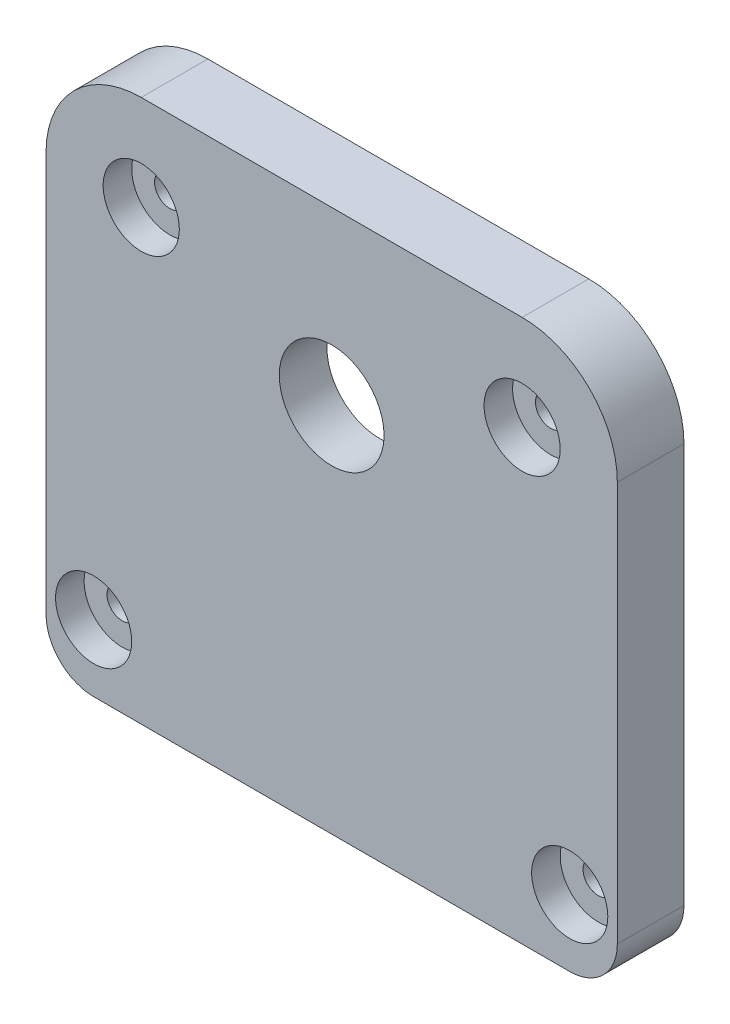
ISO-10303-21;
HEADER;
FILE_DESCRIPTION(('STEP AP214'),'2;1');
FILE_NAME('part.step','',(''),(''),'','','');
FILE_SCHEMA(('AUTOMOTIVE_DESIGN { 1 0 10303 214 1 1 1 1 }'));
ENDSEC;
DATA;
#1=APPLICATION_CONTEXT('core data for automotive mechanical design processes');
#2=APPLICATION_PROTOCOL_DEFINITION('international standard','automotive_design',2000,#1);
#3=PRODUCT_CONTEXT('',#1,'mechanical');
#4=PRODUCT('Part','Part','',(#3));
#5=PRODUCT_RELATED_PRODUCT_CATEGORY('part','',(#4));
#6=PRODUCT_DEFINITION_FORMATION('','',#4);
#7=PRODUCT_DEFINITION_CONTEXT('part definition',#1,'design');
#8=PRODUCT_DEFINITION('design','',#6,#7);
#9=PRODUCT_DEFINITION_SHAPE('','',#8);
#10=(LENGTH_UNIT() NAMED_UNIT(*) SI_UNIT(.MILLI.,.METRE.));
#11=(NAMED_UNIT(*) PLANE_ANGLE_UNIT() SI_UNIT($,.RADIAN.));
#12=(NAMED_UNIT(*) SI_UNIT($,.STERADIAN.) SOLID_ANGLE_UNIT());
#13=UNCERTAINTY_MEASURE_WITH_UNIT(LENGTH_MEASURE(1.E-05),#10,'distance_accuracy_value','');
#14=(GEOMETRIC_REPRESENTATION_CONTEXT(3) GLOBAL_UNCERTAINTY_ASSIGNED_CONTEXT((#13)) GLOBAL_UNIT_ASSIGNED_CONTEXT((#10,
#11,#12)) REPRESENTATION_CONTEXT('',''));
#15=CARTESIAN_POINT('',(0.,0.,0.));
#16=DIRECTION('',(0.,0.,1.));
#17=DIRECTION('',(1.,0.,0.));
#18=AXIS2_PLACEMENT_3D('',#15,#16,#17);
#19=CARTESIAN_POINT('',(20.0000000000015,22.0000000000005,10.));
#20=DIRECTION('',(0.,0.,-1.));
#21=DIRECTION('',(-1.,0.,0.));
#22=AXIS2_PLACEMENT_3D('',#19,#20,#21);
#23=CYLINDRICAL_SURFACE('',#22,1.60000000000141);
#24=CARTESIAN_POINT('',(20.0000000000015,22.0000000000005,3.));
#25=DIRECTION('',(0.,0.,-1.));
#26=DIRECTION('',(-1.,0.,0.));
#27=AXIS2_PLACEMENT_3D('',#24,#25,#26);
#28=CIRCLE('',#27,1.60000000000141);
#29=CARTESIAN_POINT('',(18.4000000000001,22.0000000000005,3.));
#30=VERTEX_POINT('',#29);
#31=EDGE_CURVE('E222',#30,#30,#28,.F.);
#32=ORIENTED_EDGE('',*,*,#31,.F.);
#33=EDGE_LOOP('',(#32));
#34=FACE_BOUND('',#33,.T.);
#35=CARTESIAN_POINT('',(20.0000000000015,22.0000000000005,7.));
#36=DIRECTION('',(0.,0.,1.));
#37=DIRECTION('',(1.,0.,0.));
#38=AXIS2_PLACEMENT_3D('',#35,#36,#37);
#39=CIRCLE('',#38,1.60000000000141);
#40=CARTESIAN_POINT('',(21.6000000000029,22.0000000000005,7.));
#41=VERTEX_POINT('',#40);
#42=EDGE_CURVE('E49',#41,#41,#39,.F.);
#43=ORIENTED_EDGE('',*,*,#42,.F.);
#44=EDGE_LOOP('',(#43));
#45=FACE_BOUND('',#44,.T.);
#46=ADVANCED_FACE('F45',(#34,#45),#23,.F.);
#47=CARTESIAN_POINT('',(25.0000000000016,-17.9999999999997,10.));
#48=DIRECTION('',(0.,0.,-1.));
#49=DIRECTION('',(-1.,0.,0.));
#50=AXIS2_PLACEMENT_3D('',#47,#48,#49);
#51=CYLINDRICAL_SURFACE('',#50,1.6000000000014);
#52=CARTESIAN_POINT('',(25.0000000000016,-17.9999999999997,3.));
#53=DIRECTION('',(0.,0.,-1.));
#54=DIRECTION('',(-1.,0.,0.));
#55=AXIS2_PLACEMENT_3D('',#52,#53,#54);
#56=CIRCLE('',#55,1.6000000000014);
#57=CARTESIAN_POINT('',(23.4000000000002,-17.9999999999997,3.));
#58=VERTEX_POINT('',#57);
#59=EDGE_CURVE('E225',#58,#58,#56,.F.);
#60=ORIENTED_EDGE('',*,*,#59,.F.);
#61=EDGE_LOOP('',(#60));
#62=FACE_BOUND('',#61,.T.);
#63=CARTESIAN_POINT('',(25.0000000000016,-17.9999999999997,7.));
#64=DIRECTION('',(0.,0.,1.));
#65=DIRECTION('',(1.,0.,0.));
#66=AXIS2_PLACEMENT_3D('',#63,#64,#65);
#67=CIRCLE('',#66,1.6000000000014);
#68=CARTESIAN_POINT('',(26.600000000003,-17.9999999999997,7.));
#69=VERTEX_POINT('',#68);
#70=EDGE_CURVE('E136',#69,#69,#67,.F.);
#71=ORIENTED_EDGE('',*,*,#70,.F.);
#72=EDGE_LOOP('',(#71));
#73=FACE_BOUND('',#72,.T.);
#74=ADVANCED_FACE('F146',(#62,#73),#51,.F.);
#75=CARTESIAN_POINT('',(-19.9999999999986,22.0000000000002,10.));
#76=DIRECTION('',(0.,0.,-1.));
#77=DIRECTION('',(-1.,0.,0.));
#78=AXIS2_PLACEMENT_3D('',#75,#76,#77);
#79=CYLINDRICAL_SURFACE('',#78,1.6000000000014);
#80=CARTESIAN_POINT('',(-19.9999999999986,22.0000000000002,3.));
#81=DIRECTION('',(0.,0.,-1.));
#82=DIRECTION('',(-1.,0.,0.));
#83=AXIS2_PLACEMENT_3D('',#80,#81,#82);
#84=CIRCLE('',#83,1.6000000000014);
#85=CARTESIAN_POINT('',(-21.6,22.0000000000002,3.));
#86=VERTEX_POINT('',#85);
#87=EDGE_CURVE('E228',#86,#86,#84,.F.);
#88=ORIENTED_EDGE('',*,*,#87,.F.);
#89=EDGE_LOOP('',(#88));
#90=FACE_BOUND('',#89,.T.);
#91=CARTESIAN_POINT('',(-19.9999999999986,22.0000000000002,7.));
#92=DIRECTION('',(0.,0.,1.));
#93=DIRECTION('',(1.,0.,0.));
#94=AXIS2_PLACEMENT_3D('',#91,#92,#93);
#95=CIRCLE('',#94,1.6000000000014);
#96=CARTESIAN_POINT('',(-18.3999999999972,22.0000000000002,7.));
#97=VERTEX_POINT('',#96);
#98=EDGE_CURVE('E133',#97,#97,#95,.F.);
#99=ORIENTED_EDGE('',*,*,#98,.F.);
#100=EDGE_LOOP('',(#99));
#101=FACE_BOUND('',#100,.T.);
#102=ADVANCED_FACE('F153',(#90,#101),#79,.F.);
#103=CARTESIAN_POINT('',(-24.9999999999984,-18.,10.));
#104=DIRECTION('',(0.,0.,-1.));
#105=DIRECTION('',(-1.,0.,0.));
#106=AXIS2_PLACEMENT_3D('',#103,#104,#105);
#107=CYLINDRICAL_SURFACE('',#106,1.60000000000141);
#108=CARTESIAN_POINT('',(-24.9999999999984,-18.,3.));
#109=DIRECTION('',(0.,0.,-1.));
#110=DIRECTION('',(-1.,0.,0.));
#111=AXIS2_PLACEMENT_3D('',#108,#109,#110);
#112=CIRCLE('',#111,1.60000000000141);
#113=CARTESIAN_POINT('',(-26.5999999999998,-18.,3.));
#114=VERTEX_POINT('',#113);
#115=EDGE_CURVE('E231',#114,#114,#112,.F.);
#116=ORIENTED_EDGE('',*,*,#115,.F.);
#117=EDGE_LOOP('',(#116));
#118=FACE_BOUND('',#117,.T.);
#119=CARTESIAN_POINT('',(-24.9999999999984,-18.,7.));
#120=DIRECTION('',(0.,0.,1.));
#121=DIRECTION('',(1.,0.,0.));
#122=AXIS2_PLACEMENT_3D('',#119,#120,#121);
#123=CIRCLE('',#122,1.60000000000141);
#124=CARTESIAN_POINT('',(-23.399999999997,-18.,7.));
#125=VERTEX_POINT('',#124);
#126=EDGE_CURVE('E130',#125,#125,#123,.F.);
#127=ORIENTED_EDGE('',*,*,#126,.F.);
#128=EDGE_LOOP('',(#127));
#129=FACE_BOUND('',#128,.T.);
#130=ADVANCED_FACE('F159',(#118,#129),#107,.F.);
#131=CARTESIAN_POINT('',(30.,-25.,5.));
#132=DIRECTION('',(-1.,0.,0.));
#133=DIRECTION('',(0.,0.,1.));
#134=AXIS2_PLACEMENT_3D('',#131,#132,#133);
#135=PLANE('',#134);
#136=DIRECTION('',(0.,-1.,0.));
#137=VECTOR('',#136,1.);
#138=CARTESIAN_POINT('',(30.,-25.,3.));
#139=LINE('',#138,#137);
#140=CARTESIAN_POINT('',(30.,22.,3.));
#141=VERTEX_POINT('',#140);
#142=CARTESIAN_POINT('',(30.,-20.,3.));
#143=VERTEX_POINT('',#142);
#144=EDGE_CURVE('E62',#141,#143,#139,.T.);
#145=ORIENTED_EDGE('',*,*,#144,.F.);
#146=DIRECTION('',(0.,0.,-1.));
#147=VECTOR('',#146,1.);
#148=CARTESIAN_POINT('',(30.,22.,5.));
#149=LINE('',#148,#147);
#150=CARTESIAN_POINT('',(30.,22.,10.));
#151=VERTEX_POINT('',#150);
#152=EDGE_CURVE('E200',#141,#151,#149,.F.);
#153=ORIENTED_EDGE('',*,*,#152,.T.);
#154=DIRECTION('',(0.,1.,0.));
#155=VECTOR('',#154,1.);
#156=CARTESIAN_POINT('',(30.,-25.,10.));
#157=LINE('',#156,#155);
#158=CARTESIAN_POINT('',(30.,-20.,10.));
#159=VERTEX_POINT('',#158);
#160=EDGE_CURVE('E216',#159,#151,#157,.T.);
#161=ORIENTED_EDGE('',*,*,#160,.F.);
#162=DIRECTION('',(0.,0.,-1.));
#163=VECTOR('',#162,1.);
#164=CARTESIAN_POINT('',(30.,-20.,5.));
#165=LINE('',#164,#163);
#166=EDGE_CURVE('E123',#159,#143,#165,.T.);
#167=ORIENTED_EDGE('',*,*,#166,.T.);
#168=EDGE_LOOP('',(#145,#153,#161,#167));
#169=FACE_BOUND('',#168,.T.);
#170=ADVANCED_FACE('F171',(#169),#135,.F.);
#171=CARTESIAN_POINT('',(-30.,-25.,5.));
#172=DIRECTION('',(1.,0.,0.));
#173=DIRECTION('',(0.,0.,-1.));
#174=AXIS2_PLACEMENT_3D('',#171,#172,#173);
#175=PLANE('',#174);
#176=DIRECTION('',(0.,1.,0.));
#177=VECTOR('',#176,1.);
#178=CARTESIAN_POINT('',(-30.,-25.,3.));
#179=LINE('',#178,#177);
#180=CARTESIAN_POINT('',(-30.,-20.,3.));
#181=VERTEX_POINT('',#180);
#182=CARTESIAN_POINT('',(-30.,22.,3.));
#183=VERTEX_POINT('',#182);
#184=EDGE_CURVE('E237',#181,#183,#179,.T.);
#185=ORIENTED_EDGE('',*,*,#184,.F.);
#186=DIRECTION('',(0.,0.,-1.));
#187=VECTOR('',#186,1.);
#188=CARTESIAN_POINT('',(-30.,-20.,5.));
#189=LINE('',#188,#187);
#190=CARTESIAN_POINT('',(-30.,-20.,10.));
#191=VERTEX_POINT('',#190);
#192=EDGE_CURVE('E190',#181,#191,#189,.F.);
#193=ORIENTED_EDGE('',*,*,#192,.T.);
#194=DIRECTION('',(0.,-1.,0.));
#195=VECTOR('',#194,1.);
#196=CARTESIAN_POINT('',(-30.,-25.,10.));
#197=LINE('',#196,#195);
#198=CARTESIAN_POINT('',(-30.,22.,10.));
#199=VERTEX_POINT('',#198);
#200=EDGE_CURVE('E214',#199,#191,#197,.T.);
#201=ORIENTED_EDGE('',*,*,#200,.F.);
#202=DIRECTION('',(0.,0.,1.));
#203=VECTOR('',#202,1.);
#204=CARTESIAN_POINT('',(-30.,22.,5.));
#205=LINE('',#204,#203);
#206=EDGE_CURVE('E205',#199,#183,#205,.F.);
#207=ORIENTED_EDGE('',*,*,#206,.T.);
#208=EDGE_LOOP('',(#185,#193,#201,#207));
#209=FACE_BOUND('',#208,.T.);
#210=ADVANCED_FACE('F168',(#209),#175,.F.);
#211=CARTESIAN_POINT('',(-30.,-25.,5.));
#212=DIRECTION('',(0.,1.,0.));
#213=DIRECTION('',(0.,0.,1.));
#214=AXIS2_PLACEMENT_3D('',#211,#212,#213);
#215=PLANE('',#214);
#216=DIRECTION('',(-1.,0.,0.));
#217=VECTOR('',#216,1.);
#218=CARTESIAN_POINT('',(-30.,-25.,3.));
#219=LINE('',#218,#217);
#220=CARTESIAN_POINT('',(25.,-25.,3.));
#221=VERTEX_POINT('',#220);
#222=CARTESIAN_POINT('',(-25.,-25.,3.));
#223=VERTEX_POINT('',#222);
#224=EDGE_CURVE('E112',#221,#223,#219,.T.);
#225=ORIENTED_EDGE('',*,*,#224,.F.);
#226=DIRECTION('',(0.,0.,-1.));
#227=VECTOR('',#226,1.);
#228=CARTESIAN_POINT('',(25.,-25.,5.));
#229=LINE('',#228,#227);
#230=CARTESIAN_POINT('',(25.,-25.,10.));
#231=VERTEX_POINT('',#230);
#232=EDGE_CURVE('E69',#221,#231,#229,.F.);
#233=ORIENTED_EDGE('',*,*,#232,.T.);
#234=DIRECTION('',(1.,0.,0.));
#235=VECTOR('',#234,1.);
#236=CARTESIAN_POINT('',(-30.,-25.,10.));
#237=LINE('',#236,#235);
#238=CARTESIAN_POINT('',(-25.,-25.,10.));
#239=VERTEX_POINT('',#238);
#240=EDGE_CURVE('E212',#239,#231,#237,.T.);
#241=ORIENTED_EDGE('',*,*,#240,.F.);
#242=DIRECTION('',(0.,0.,-1.));
#243=VECTOR('',#242,1.);
#244=CARTESIAN_POINT('',(-25.,-25.,5.));
#245=LINE('',#244,#243);
#246=EDGE_CURVE('E120',#239,#223,#245,.T.);
#247=ORIENTED_EDGE('',*,*,#246,.T.);
#248=EDGE_LOOP('',(#225,#233,#241,#247));
#249=FACE_BOUND('',#248,.T.);
#250=ADVANCED_FACE('F118',(#249),#215,.F.);
#251=CARTESIAN_POINT('',(0.,32.,0.));
#252=DIRECTION('',(0.,-1.,0.));
#253=DIRECTION('',(0.,0.,-1.));
#254=AXIS2_PLACEMENT_3D('',#251,#252,#253);
#255=PLANE('',#254);
#256=DIRECTION('',(1.,0.,0.));
#257=VECTOR('',#256,1.);
#258=CARTESIAN_POINT('',(0.,32.,3.));
#259=LINE('',#258,#257);
#260=CARTESIAN_POINT('',(-20.,32.,3.));
#261=VERTEX_POINT('',#260);
#262=CARTESIAN_POINT('',(20.,32.,3.));
#263=VERTEX_POINT('',#262);
#264=EDGE_CURVE('E239',#261,#263,#259,.T.);
#265=ORIENTED_EDGE('',*,*,#264,.F.);
#266=DIRECTION('',(0.,0.,1.));
#267=VECTOR('',#266,1.);
#268=CARTESIAN_POINT('',(-20.,32.,0.));
#269=LINE('',#268,#267);
#270=CARTESIAN_POINT('',(-20.,32.,10.));
#271=VERTEX_POINT('',#270);
#272=EDGE_CURVE('E210',#261,#271,#269,.T.);
#273=ORIENTED_EDGE('',*,*,#272,.T.);
#274=DIRECTION('',(1.,0.,0.));
#275=VECTOR('',#274,1.);
#276=CARTESIAN_POINT('',(-30.,32.,10.));
#277=LINE('',#276,#275);
#278=CARTESIAN_POINT('',(20.,32.,10.));
#279=VERTEX_POINT('',#278);
#280=EDGE_CURVE('E219',#271,#279,#277,.T.);
#281=ORIENTED_EDGE('',*,*,#280,.T.);
#282=DIRECTION('',(0.,0.,-1.));
#283=VECTOR('',#282,1.);
#284=CARTESIAN_POINT('',(20.,32.,0.));
#285=LINE('',#284,#283);
#286=EDGE_CURVE('E202',#279,#263,#285,.T.);
#287=ORIENTED_EDGE('',*,*,#286,.T.);
#288=EDGE_LOOP('',(#265,#273,#281,#287));
#289=FACE_BOUND('',#288,.T.);
#290=ADVANCED_FACE('F167',(#289),#255,.F.);
#291=CARTESIAN_POINT('',(-20.,22.,0.));
#292=DIRECTION('',(0.,0.,1.));
#293=DIRECTION('',(1.,0.,0.));
#294=AXIS2_PLACEMENT_3D('',#291,#292,#293);
#295=CYLINDRICAL_SURFACE('',#294,10.);
#296=ORIENTED_EDGE('',*,*,#272,.F.);
#297=CARTESIAN_POINT('',(-20.,22.,3.));
#298=DIRECTION('',(0.,0.,-1.));
#299=DIRECTION('',(-1.,0.,0.));
#300=AXIS2_PLACEMENT_3D('',#297,#298,#299);
#301=CIRCLE('',#300,10.);
#302=EDGE_CURVE('E234',#261,#183,#301,.F.);
#303=ORIENTED_EDGE('',*,*,#302,.T.);
#304=ORIENTED_EDGE('',*,*,#206,.F.);
#305=CARTESIAN_POINT('',(-20.,22.,10.));
#306=DIRECTION('',(0.,0.,-1.));
#307=DIRECTION('',(-1.,0.,0.));
#308=AXIS2_PLACEMENT_3D('',#305,#306,#307);
#309=CIRCLE('',#308,10.);
#310=EDGE_CURVE('E208',#271,#199,#309,.F.);
#311=ORIENTED_EDGE('',*,*,#310,.F.);
#312=EDGE_LOOP('',(#296,#303,#304,#311));
#313=FACE_BOUND('',#312,.T.);
#314=ADVANCED_FACE('F176',(#313),#295,.T.);
#315=CARTESIAN_POINT('',(20.,22.,0.));
#316=DIRECTION('',(0.,0.,-1.));
#317=DIRECTION('',(-1.,0.,0.));
#318=AXIS2_PLACEMENT_3D('',#315,#316,#317);
#319=CYLINDRICAL_SURFACE('',#318,10.);
#320=ORIENTED_EDGE('',*,*,#152,.F.);
#321=CARTESIAN_POINT('',(20.,22.,3.));
#322=DIRECTION('',(0.,0.,-1.));
#323=DIRECTION('',(-1.,0.,0.));
#324=AXIS2_PLACEMENT_3D('',#321,#322,#323);
#325=CIRCLE('',#324,10.);
#326=EDGE_CURVE('E241',#141,#263,#325,.F.);
#327=ORIENTED_EDGE('',*,*,#326,.T.);
#328=ORIENTED_EDGE('',*,*,#286,.F.);
#329=CARTESIAN_POINT('',(20.,22.,10.));
#330=DIRECTION('',(0.,0.,-1.));
#331=DIRECTION('',(-1.,0.,0.));
#332=AXIS2_PLACEMENT_3D('',#329,#330,#331);
#333=CIRCLE('',#332,10.);
#334=EDGE_CURVE('E196',#151,#279,#333,.F.);
#335=ORIENTED_EDGE('',*,*,#334,.F.);
#336=EDGE_LOOP('',(#320,#327,#328,#335));
#337=FACE_BOUND('',#336,.T.);
#338=ADVANCED_FACE('F179',(#337),#319,.T.);
#339=CARTESIAN_POINT('',(-25.,-20.,5.));
#340=DIRECTION('',(0.,0.,-1.));
#341=DIRECTION('',(-1.,0.,0.));
#342=AXIS2_PLACEMENT_3D('',#339,#340,#341);
#343=CYLINDRICAL_SURFACE('',#342,5.);
#344=ORIENTED_EDGE('',*,*,#192,.F.);
#345=CARTESIAN_POINT('',(-25.,-20.,3.));
#346=DIRECTION('',(0.,0.,-1.));
#347=DIRECTION('',(-1.,0.,0.));
#348=AXIS2_PLACEMENT_3D('',#345,#346,#347);
#349=CIRCLE('',#348,5.);
#350=EDGE_CURVE('E191',#181,#223,#349,.F.);
#351=ORIENTED_EDGE('',*,*,#350,.T.);
#352=ORIENTED_EDGE('',*,*,#246,.F.);
#353=CARTESIAN_POINT('',(-25.,-20.,10.));
#354=DIRECTION('',(0.,0.,-1.));
#355=DIRECTION('',(-1.,0.,0.));
#356=AXIS2_PLACEMENT_3D('',#353,#354,#355);
#357=CIRCLE('',#356,5.);
#358=EDGE_CURVE('E126',#191,#239,#357,.F.);
#359=ORIENTED_EDGE('',*,*,#358,.F.);
#360=EDGE_LOOP('',(#344,#351,#352,#359));
#361=FACE_BOUND('',#360,.T.);
#362=ADVANCED_FACE('F182',(#361),#343,.T.);
#363=CARTESIAN_POINT('',(25.,-20.,5.));
#364=DIRECTION('',(0.,0.,-1.));
#365=DIRECTION('',(-1.,0.,0.));
#366=AXIS2_PLACEMENT_3D('',#363,#364,#365);
#367=CYLINDRICAL_SURFACE('',#366,5.);
#368=ORIENTED_EDGE('',*,*,#232,.F.);
#369=CARTESIAN_POINT('',(25.,-20.,3.));
#370=DIRECTION('',(0.,0.,-1.));
#371=DIRECTION('',(-1.,0.,0.));
#372=AXIS2_PLACEMENT_3D('',#369,#370,#371);
#373=CIRCLE('',#372,5.);
#374=EDGE_CURVE('E11',#221,#143,#373,.F.);
#375=ORIENTED_EDGE('',*,*,#374,.T.);
#376=ORIENTED_EDGE('',*,*,#166,.F.);
#377=CARTESIAN_POINT('',(25.,-20.,10.));
#378=DIRECTION('',(0.,0.,-1.));
#379=DIRECTION('',(-1.,0.,0.));
#380=AXIS2_PLACEMENT_3D('',#377,#378,#379);
#381=CIRCLE('',#380,5.);
#382=EDGE_CURVE('E54',#231,#159,#381,.F.);
#383=ORIENTED_EDGE('',*,*,#382,.F.);
#384=EDGE_LOOP('',(#368,#375,#376,#383));
#385=FACE_BOUND('',#384,.T.);
#386=ADVANCED_FACE('F47',(#385),#367,.T.);
#387=CARTESIAN_POINT('',(0.,0.,10.));
#388=DIRECTION('',(0.,0.,-1.));
#389=DIRECTION('',(-1.,0.,0.));
#390=AXIS2_PLACEMENT_3D('',#387,#388,#389);
#391=PLANE('',#390);
#392=CARTESIAN_POINT('',(0.,14.,10.));
#393=DIRECTION('',(0.,0.,-1.));
#394=DIRECTION('',(-1.,0.,0.));
#395=AXIS2_PLACEMENT_3D('',#392,#393,#394);
#396=CIRCLE('',#395,5.5);
#397=CARTESIAN_POINT('',(-5.5,14.,10.));
#398=VERTEX_POINT('',#397);
#399=EDGE_CURVE('E273',#398,#398,#396,.T.);
#400=ORIENTED_EDGE('',*,*,#399,.T.);
#401=EDGE_LOOP('',(#400));
#402=FACE_BOUND('',#401,.T.);
#403=CARTESIAN_POINT('',(20.0000000000015,22.0000000000005,10.));
#404=DIRECTION('',(0.,0.,1.));
#405=DIRECTION('',(1.,0.,0.));
#406=AXIS2_PLACEMENT_3D('',#403,#404,#405);
#407=CIRCLE('',#406,3.99999999999843);
#408=CARTESIAN_POINT('',(23.9999999999999,22.0000000000005,10.));
#409=VERTEX_POINT('',#408);
#410=EDGE_CURVE('E249',#409,#409,#407,.T.);
#411=ORIENTED_EDGE('',*,*,#410,.F.);
#412=EDGE_LOOP('',(#411));
#413=FACE_BOUND('',#412,.T.);
#414=CARTESIAN_POINT('',(-24.9999999999984,-18.,10.));
#415=DIRECTION('',(0.,0.,1.));
#416=DIRECTION('',(1.,0.,0.));
#417=AXIS2_PLACEMENT_3D('',#414,#415,#416);
#418=CIRCLE('',#417,3.99999999999843);
#419=CARTESIAN_POINT('',(-21.,-18.,10.));
#420=VERTEX_POINT('',#419);
#421=EDGE_CURVE('E255',#420,#420,#418,.T.);
#422=ORIENTED_EDGE('',*,*,#421,.F.);
#423=EDGE_LOOP('',(#422));
#424=FACE_BOUND('',#423,.T.);
#425=CARTESIAN_POINT('',(25.0000000000016,-17.9999999999997,10.));
#426=DIRECTION('',(0.,0.,1.));
#427=DIRECTION('',(1.,0.,0.));
#428=AXIS2_PLACEMENT_3D('',#425,#426,#427);
#429=CIRCLE('',#428,3.99999999999843);
#430=CARTESIAN_POINT('',(29.,-17.9999999999997,10.));
#431=VERTEX_POINT('',#430);
#432=EDGE_CURVE('E256',#431,#431,#429,.T.);
#433=ORIENTED_EDGE('',*,*,#432,.F.);
#434=EDGE_LOOP('',(#433));
#435=FACE_BOUND('',#434,.T.);
#436=CARTESIAN_POINT('',(-19.9999999999986,22.0000000000002,10.));
#437=DIRECTION('',(0.,0.,1.));
#438=DIRECTION('',(1.,0.,0.));
#439=AXIS2_PLACEMENT_3D('',#436,#437,#438);
#440=CIRCLE('',#439,3.99999999999843);
#441=CARTESIAN_POINT('',(-16.0000000000002,22.0000000000002,10.));
#442=VERTEX_POINT('',#441);
#443=EDGE_CURVE('E246',#442,#442,#440,.T.);
#444=ORIENTED_EDGE('',*,*,#443,.F.);
#445=EDGE_LOOP('',(#444));
#446=FACE_BOUND('',#445,.T.);
#447=ORIENTED_EDGE('',*,*,#240,.T.);
#448=ORIENTED_EDGE('',*,*,#382,.T.);
#449=ORIENTED_EDGE('',*,*,#160,.T.);
#450=ORIENTED_EDGE('',*,*,#334,.T.);
#451=ORIENTED_EDGE('',*,*,#280,.F.);
#452=ORIENTED_EDGE('',*,*,#310,.T.);
#453=ORIENTED_EDGE('',*,*,#200,.T.);
#454=ORIENTED_EDGE('',*,*,#358,.T.);
#455=EDGE_LOOP('',(#447,#448,#449,#450,#451,#452,#453,#454));
#456=FACE_BOUND('',#455,.T.);
#457=ADVANCED_FACE('F161',(#402,#413,#424,#435,#446,#456),#391,.F.);
#458=CARTESIAN_POINT('',(0.,0.,3.));
#459=DIRECTION('',(0.,0.,-1.));
#460=DIRECTION('',(-1.,0.,0.));
#461=AXIS2_PLACEMENT_3D('',#458,#459,#460);
#462=PLANE('',#461);
#463=CARTESIAN_POINT('',(0.,14.,3.));
#464=DIRECTION('',(0.,0.,-1.));
#465=DIRECTION('',(-1.,0.,0.));
#466=AXIS2_PLACEMENT_3D('',#463,#464,#465);
#467=CIRCLE('',#466,15.);
#468=CARTESIAN_POINT('',(-15.,14.,3.));
#469=VERTEX_POINT('',#468);
#470=EDGE_CURVE('E270',#469,#469,#467,.T.);
#471=ORIENTED_EDGE('',*,*,#470,.F.);
#472=EDGE_LOOP('',(#471));
#473=FACE_BOUND('',#472,.T.);
#474=ORIENTED_EDGE('',*,*,#264,.T.);
#475=ORIENTED_EDGE('',*,*,#326,.F.);
#476=ORIENTED_EDGE('',*,*,#144,.T.);
#477=ORIENTED_EDGE('',*,*,#374,.F.);
#478=ORIENTED_EDGE('',*,*,#224,.T.);
#479=ORIENTED_EDGE('',*,*,#350,.F.);
#480=ORIENTED_EDGE('',*,*,#184,.T.);
#481=ORIENTED_EDGE('',*,*,#302,.F.);
#482=EDGE_LOOP('',(#474,#475,#476,#477,#478,#479,#480,#481));
#483=FACE_BOUND('',#482,.T.);
#484=ORIENTED_EDGE('',*,*,#115,.T.);
#485=EDGE_LOOP('',(#484));
#486=FACE_BOUND('',#485,.T.);
#487=ORIENTED_EDGE('',*,*,#87,.T.);
#488=EDGE_LOOP('',(#487));
#489=FACE_BOUND('',#488,.T.);
#490=ORIENTED_EDGE('',*,*,#59,.T.);
#491=EDGE_LOOP('',(#490));
#492=FACE_BOUND('',#491,.T.);
#493=ORIENTED_EDGE('',*,*,#31,.T.);
#494=EDGE_LOOP('',(#493));
#495=FACE_BOUND('',#494,.T.);
#496=ADVANCED_FACE('F110',(#473,#483,#486,#489,#492,#495),#462,.T.);
#497=CARTESIAN_POINT('',(-19.9999999999986,22.0000000000002,7.));
#498=DIRECTION('',(0.,0.,1.));
#499=DIRECTION('',(1.,0.,0.));
#500=AXIS2_PLACEMENT_3D('',#497,#498,#499);
#501=PLANE('',#500);
#502=CARTESIAN_POINT('',(-19.9999999999986,22.0000000000002,7.));
#503=DIRECTION('',(0.,0.,1.));
#504=DIRECTION('',(1.,0.,0.));
#505=AXIS2_PLACEMENT_3D('',#502,#503,#504);
#506=CIRCLE('',#505,3.99999999999843);
#507=CARTESIAN_POINT('',(-16.0000000000002,22.0000000000002,7.));
#508=VERTEX_POINT('',#507);
#509=EDGE_CURVE('E134',#508,#508,#506,.T.);
#510=ORIENTED_EDGE('',*,*,#509,.T.);
#511=EDGE_LOOP('',(#510));
#512=FACE_BOUND('',#511,.T.);
#513=ORIENTED_EDGE('',*,*,#98,.T.);
#514=EDGE_LOOP('',(#513));
#515=FACE_BOUND('',#514,.T.);
#516=ADVANCED_FACE('F303',(#512,#515),#501,.T.);
#517=CARTESIAN_POINT('',(-19.9999999999986,22.0000000000002,7.));
#518=DIRECTION('',(0.,0.,1.));
#519=DIRECTION('',(1.,0.,0.));
#520=AXIS2_PLACEMENT_3D('',#517,#518,#519);
#521=CYLINDRICAL_SURFACE('',#520,3.99999999999843);
#522=ORIENTED_EDGE('',*,*,#509,.F.);
#523=EDGE_LOOP('',(#522));
#524=FACE_BOUND('',#523,.T.);
#525=ORIENTED_EDGE('',*,*,#443,.T.);
#526=EDGE_LOOP('',(#525));
#527=FACE_BOUND('',#526,.T.);
#528=ADVANCED_FACE('F309',(#524,#527),#521,.F.);
#529=CARTESIAN_POINT('',(25.0000000000016,-17.9999999999997,7.));
#530=DIRECTION('',(0.,0.,1.));
#531=DIRECTION('',(1.,0.,0.));
#532=AXIS2_PLACEMENT_3D('',#529,#530,#531);
#533=PLANE('',#532);
#534=CARTESIAN_POINT('',(25.0000000000016,-17.9999999999997,7.));
#535=DIRECTION('',(0.,0.,1.));
#536=DIRECTION('',(1.,0.,0.));
#537=AXIS2_PLACEMENT_3D('',#534,#535,#536);
#538=CIRCLE('',#537,3.99999999999843);
#539=CARTESIAN_POINT('',(29.,-17.9999999999997,7.));
#540=VERTEX_POINT('',#539);
#541=EDGE_CURVE('E264',#540,#540,#538,.T.);
#542=ORIENTED_EDGE('',*,*,#541,.T.);
#543=EDGE_LOOP('',(#542));
#544=FACE_BOUND('',#543,.T.);
#545=ORIENTED_EDGE('',*,*,#70,.T.);
#546=EDGE_LOOP('',(#545));
#547=FACE_BOUND('',#546,.T.);
#548=ADVANCED_FACE('F349',(#544,#547),#533,.T.);
#549=CARTESIAN_POINT('',(25.0000000000016,-17.9999999999997,7.));
#550=DIRECTION('',(0.,0.,1.));
#551=DIRECTION('',(1.,0.,0.));
#552=AXIS2_PLACEMENT_3D('',#549,#550,#551);
#553=CYLINDRICAL_SURFACE('',#552,3.99999999999843);
#554=ORIENTED_EDGE('',*,*,#541,.F.);
#555=EDGE_LOOP('',(#554));
#556=FACE_BOUND('',#555,.T.);
#557=ORIENTED_EDGE('',*,*,#432,.T.);
#558=EDGE_LOOP('',(#557));
#559=FACE_BOUND('',#558,.T.);
#560=ADVANCED_FACE('F340',(#556,#559),#553,.F.);
#561=CARTESIAN_POINT('',(-24.9999999999984,-18.,7.));
#562=DIRECTION('',(0.,0.,1.));
#563=DIRECTION('',(1.,0.,0.));
#564=AXIS2_PLACEMENT_3D('',#561,#562,#563);
#565=PLANE('',#564);
#566=CARTESIAN_POINT('',(-24.9999999999984,-18.,7.));
#567=DIRECTION('',(0.,0.,1.));
#568=DIRECTION('',(1.,0.,0.));
#569=AXIS2_PLACEMENT_3D('',#566,#567,#568);
#570=CIRCLE('',#569,3.99999999999843);
#571=CARTESIAN_POINT('',(-21.,-18.,7.));
#572=VERTEX_POINT('',#571);
#573=EDGE_CURVE('E252',#572,#572,#570,.T.);
#574=ORIENTED_EDGE('',*,*,#573,.T.);
#575=EDGE_LOOP('',(#574));
#576=FACE_BOUND('',#575,.T.);
#577=ORIENTED_EDGE('',*,*,#126,.T.);
#578=EDGE_LOOP('',(#577));
#579=FACE_BOUND('',#578,.T.);
#580=ADVANCED_FACE('F337',(#576,#579),#565,.T.);
#581=CARTESIAN_POINT('',(-24.9999999999984,-18.,7.));
#582=DIRECTION('',(0.,0.,1.));
#583=DIRECTION('',(1.,0.,0.));
#584=AXIS2_PLACEMENT_3D('',#581,#582,#583);
#585=CYLINDRICAL_SURFACE('',#584,3.99999999999843);
#586=ORIENTED_EDGE('',*,*,#573,.F.);
#587=EDGE_LOOP('',(#586));
#588=FACE_BOUND('',#587,.T.);
#589=ORIENTED_EDGE('',*,*,#421,.T.);
#590=EDGE_LOOP('',(#589));
#591=FACE_BOUND('',#590,.T.);
#592=ADVANCED_FACE('F339',(#588,#591),#585,.F.);
#593=CARTESIAN_POINT('',(20.0000000000015,22.0000000000005,7.));
#594=DIRECTION('',(0.,0.,1.));
#595=DIRECTION('',(1.,0.,0.));
#596=AXIS2_PLACEMENT_3D('',#593,#594,#595);
#597=PLANE('',#596);
#598=CARTESIAN_POINT('',(20.0000000000015,22.0000000000005,7.));
#599=DIRECTION('',(0.,0.,1.));
#600=DIRECTION('',(1.,0.,0.));
#601=AXIS2_PLACEMENT_3D('',#598,#599,#600);
#602=CIRCLE('',#601,3.99999999999843);
#603=CARTESIAN_POINT('',(23.9999999999999,22.0000000000005,7.));
#604=VERTEX_POINT('',#603);
#605=EDGE_CURVE('E259',#604,#604,#602,.T.);
#606=ORIENTED_EDGE('',*,*,#605,.T.);
#607=EDGE_LOOP('',(#606));
#608=FACE_BOUND('',#607,.T.);
#609=ORIENTED_EDGE('',*,*,#42,.T.);
#610=EDGE_LOOP('',(#609));
#611=FACE_BOUND('',#610,.T.);
#612=ADVANCED_FACE('F143',(#608,#611),#597,.T.);
#613=CARTESIAN_POINT('',(20.0000000000015,22.0000000000005,7.));
#614=DIRECTION('',(0.,0.,1.));
#615=DIRECTION('',(1.,0.,0.));
#616=AXIS2_PLACEMENT_3D('',#613,#614,#615);
#617=CYLINDRICAL_SURFACE('',#616,3.99999999999843);
#618=ORIENTED_EDGE('',*,*,#605,.F.);
#619=EDGE_LOOP('',(#618));
#620=FACE_BOUND('',#619,.T.);
#621=ORIENTED_EDGE('',*,*,#410,.T.);
#622=EDGE_LOOP('',(#621));
#623=FACE_BOUND('',#622,.T.);
#624=ADVANCED_FACE('F298',(#620,#623),#617,.F.);
#625=CARTESIAN_POINT('',(0.,14.,5.));
#626=DIRECTION('',(0.,0.,-1.));
#627=DIRECTION('',(-1.,0.,0.));
#628=AXIS2_PLACEMENT_3D('',#625,#626,#627);
#629=CYLINDRICAL_SURFACE('',#628,15.);
#630=CARTESIAN_POINT('',(0.,14.,5.));
#631=DIRECTION('',(0.,0.,-1.));
#632=DIRECTION('',(-1.,0.,0.));
#633=AXIS2_PLACEMENT_3D('',#630,#631,#632);
#634=CIRCLE('',#633,15.);
#635=CARTESIAN_POINT('',(-15.,14.,5.));
#636=VERTEX_POINT('',#635);
#637=EDGE_CURVE('E267',#636,#636,#634,.T.);
#638=ORIENTED_EDGE('',*,*,#637,.F.);
#639=EDGE_LOOP('',(#638));
#640=FACE_BOUND('',#639,.T.);
#641=ORIENTED_EDGE('',*,*,#470,.T.);
#642=EDGE_LOOP('',(#641));
#643=FACE_BOUND('',#642,.T.);
#644=ADVANCED_FACE('F292',(#640,#643),#629,.F.);
#645=CARTESIAN_POINT('',(0.,0.,5.));
#646=DIRECTION('',(0.,0.,-1.));
#647=DIRECTION('',(-1.,0.,0.));
#648=AXIS2_PLACEMENT_3D('',#645,#646,#647);
#649=PLANE('',#648);
#650=CARTESIAN_POINT('',(0.,14.,5.));
#651=DIRECTION('',(0.,0.,-1.));
#652=DIRECTION('',(-1.,0.,0.));
#653=AXIS2_PLACEMENT_3D('',#650,#651,#652);
#654=CIRCLE('',#653,5.5);
#655=CARTESIAN_POINT('',(-5.5,14.,5.));
#656=VERTEX_POINT('',#655);
#657=EDGE_CURVE('E276',#656,#656,#654,.T.);
#658=ORIENTED_EDGE('',*,*,#657,.F.);
#659=EDGE_LOOP('',(#658));
#660=FACE_BOUND('',#659,.T.);
#661=ORIENTED_EDGE('',*,*,#637,.T.);
#662=EDGE_LOOP('',(#661));
#663=FACE_BOUND('',#662,.T.);
#664=ADVANCED_FACE('F286',(#660,#663),#649,.T.);
#665=CARTESIAN_POINT('',(0.,14.,10.));
#666=DIRECTION('',(0.,0.,-1.));
#667=DIRECTION('',(-1.,0.,0.));
#668=AXIS2_PLACEMENT_3D('',#665,#666,#667);
#669=CYLINDRICAL_SURFACE('',#668,5.5);
#670=ORIENTED_EDGE('',*,*,#399,.F.);
#671=EDGE_LOOP('',(#670));
#672=FACE_BOUND('',#671,.T.);
#673=ORIENTED_EDGE('',*,*,#657,.T.);
#674=EDGE_LOOP('',(#673));
#675=FACE_BOUND('',#674,.T.);
#676=ADVANCED_FACE('F283',(#672,#675),#669,.F.);
#677=CLOSED_SHELL('',(#46,#74,#102,#130,#170,#210,#250,#290,#314,#338,#362,#386,#457,#496,#516,
#528,#548,#560,#580,#592,#612,#624,#644,#664,#676));
#678=MANIFOLD_SOLID_BREP('B2',#677);
#679=ADVANCED_BREP_SHAPE_REPRESENTATION('',(#18,#678),#14);
#680=SHAPE_DEFINITION_REPRESENTATION(#9,#679);
ENDSEC;
END-ISO-10303-21;
